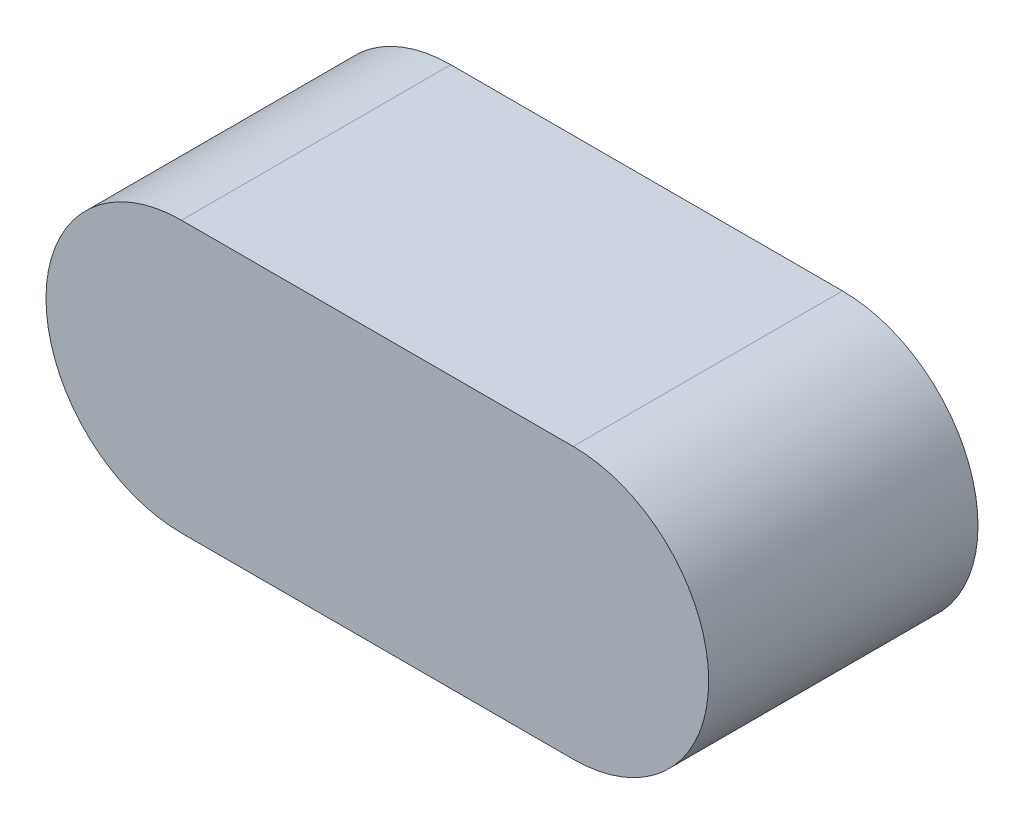
ISO-10303-21;
HEADER;
FILE_DESCRIPTION(('STEP AP214'),'2;1');
FILE_NAME('part.step','',(''),(''),'','','');
FILE_SCHEMA(('AUTOMOTIVE_DESIGN { 1 0 10303 214 1 1 1 1 }'));
ENDSEC;
DATA;
#1=APPLICATION_CONTEXT('core data for automotive mechanical design processes');
#2=APPLICATION_PROTOCOL_DEFINITION('international standard','automotive_design',2000,#1);
#3=PRODUCT_CONTEXT('',#1,'mechanical');
#4=PRODUCT('Part','Part','',(#3));
#5=PRODUCT_RELATED_PRODUCT_CATEGORY('part','',(#4));
#6=PRODUCT_DEFINITION_FORMATION('','',#4);
#7=PRODUCT_DEFINITION_CONTEXT('part definition',#1,'design');
#8=PRODUCT_DEFINITION('design','',#6,#7);
#9=PRODUCT_DEFINITION_SHAPE('','',#8);
#10=(LENGTH_UNIT() NAMED_UNIT(*) SI_UNIT(.MILLI.,.METRE.));
#11=(NAMED_UNIT(*) PLANE_ANGLE_UNIT() SI_UNIT($,.RADIAN.));
#12=(NAMED_UNIT(*) SI_UNIT($,.STERADIAN.) SOLID_ANGLE_UNIT());
#13=UNCERTAINTY_MEASURE_WITH_UNIT(LENGTH_MEASURE(1.E-05),#10,'distance_accuracy_value','');
#14=(GEOMETRIC_REPRESENTATION_CONTEXT(3) GLOBAL_UNCERTAINTY_ASSIGNED_CONTEXT((#13)) GLOBAL_UNIT_ASSIGNED_CONTEXT((#10,
#11,#12)) REPRESENTATION_CONTEXT('',''));
#15=CARTESIAN_POINT('',(0.,0.,0.));
#16=DIRECTION('',(0.,0.,1.));
#17=DIRECTION('',(1.,0.,0.));
#18=AXIS2_PLACEMENT_3D('',#15,#16,#17);
#19=CARTESIAN_POINT('',(-120.,0.,162.));
#20=DIRECTION('',(0.,0.,-1.));
#21=DIRECTION('',(-1.,0.,0.));
#22=AXIS2_PLACEMENT_3D('',#19,#20,#21);
#23=CYLINDRICAL_SURFACE('',#22,83.);
#24=CARTESIAN_POINT('',(-120.,0.,0.));
#25=DIRECTION('',(0.,0.,1.));
#26=DIRECTION('',(1.,0.,0.));
#27=AXIS2_PLACEMENT_3D('',#24,#25,#26);
#28=CIRCLE('',#27,83.);
#29=CARTESIAN_POINT('',(-120.,83.,0.));
#30=VERTEX_POINT('',#29);
#31=CARTESIAN_POINT('',(-120.,-83.,0.));
#32=VERTEX_POINT('',#31);
#33=EDGE_CURVE('E132',#30,#32,#28,.T.);
#34=ORIENTED_EDGE('',*,*,#33,.T.);
#35=DIRECTION('',(0.,0.,1.));
#36=VECTOR('',#35,1.);
#37=CARTESIAN_POINT('',(-120.,-83.,162.));
#38=LINE('',#37,#36);
#39=CARTESIAN_POINT('',(-120.,-83.,165.));
#40=VERTEX_POINT('',#39);
#41=EDGE_CURVE('E11',#40,#32,#38,.F.);
#42=ORIENTED_EDGE('',*,*,#41,.F.);
#43=CARTESIAN_POINT('',(-120.,0.,165.));
#44=DIRECTION('',(0.,0.,1.));
#45=DIRECTION('',(1.,0.,0.));
#46=AXIS2_PLACEMENT_3D('',#43,#44,#45);
#47=CIRCLE('',#46,83.);
#48=CARTESIAN_POINT('',(-120.,83.,165.));
#49=VERTEX_POINT('',#48);
#50=EDGE_CURVE('E116',#49,#40,#47,.T.);
#51=ORIENTED_EDGE('',*,*,#50,.F.);
#52=DIRECTION('',(0.,0.,-1.));
#53=VECTOR('',#52,1.);
#54=CARTESIAN_POINT('',(-120.,83.,162.));
#55=LINE('',#54,#53);
#56=EDGE_CURVE('E128',#49,#30,#55,.T.);
#57=ORIENTED_EDGE('',*,*,#56,.T.);
#58=EDGE_LOOP('',(#34,#42,#51,#57));
#59=FACE_BOUND('',#58,.T.);
#60=ADVANCED_FACE('F39',(#59),#23,.T.);
#61=CARTESIAN_POINT('',(-120.,-83.,162.));
#62=DIRECTION('',(0.,1.,0.));
#63=DIRECTION('',(0.,0.,1.));
#64=AXIS2_PLACEMENT_3D('',#61,#62,#63);
#65=PLANE('',#64);
#66=DIRECTION('',(1.,0.,0.));
#67=VECTOR('',#66,1.);
#68=CARTESIAN_POINT('',(-120.,-83.,0.));
#69=LINE('',#68,#67);
#70=CARTESIAN_POINT('',(120.,-83.,0.));
#71=VERTEX_POINT('',#70);
#72=EDGE_CURVE('E43',#32,#71,#69,.T.);
#73=ORIENTED_EDGE('',*,*,#72,.T.);
#74=DIRECTION('',(0.,0.,-1.));
#75=VECTOR('',#74,1.);
#76=CARTESIAN_POINT('',(120.,-83.,162.));
#77=LINE('',#76,#75);
#78=CARTESIAN_POINT('',(120.,-83.,165.));
#79=VERTEX_POINT('',#78);
#80=EDGE_CURVE('E48',#79,#71,#77,.T.);
#81=ORIENTED_EDGE('',*,*,#80,.F.);
#82=DIRECTION('',(1.,0.,0.));
#83=VECTOR('',#82,1.);
#84=CARTESIAN_POINT('',(-120.,-83.,165.));
#85=LINE('',#84,#83);
#86=EDGE_CURVE('E110',#40,#79,#85,.T.);
#87=ORIENTED_EDGE('',*,*,#86,.F.);
#88=ORIENTED_EDGE('',*,*,#41,.T.);
#89=EDGE_LOOP('',(#73,#81,#87,#88));
#90=FACE_BOUND('',#89,.T.);
#91=ADVANCED_FACE('F121',(#90),#65,.F.);
#92=CARTESIAN_POINT('',(120.,0.,162.));
#93=DIRECTION('',(0.,0.,-1.));
#94=DIRECTION('',(-1.,0.,0.));
#95=AXIS2_PLACEMENT_3D('',#92,#93,#94);
#96=CYLINDRICAL_SURFACE('',#95,83.);
#97=CARTESIAN_POINT('',(120.,0.,0.));
#98=DIRECTION('',(0.,0.,1.));
#99=DIRECTION('',(1.,0.,0.));
#100=AXIS2_PLACEMENT_3D('',#97,#98,#99);
#101=CIRCLE('',#100,83.);
#102=CARTESIAN_POINT('',(120.,83.,0.));
#103=VERTEX_POINT('',#102);
#104=EDGE_CURVE('E137',#71,#103,#101,.T.);
#105=ORIENTED_EDGE('',*,*,#104,.T.);
#106=DIRECTION('',(0.,0.,-1.));
#107=VECTOR('',#106,1.);
#108=CARTESIAN_POINT('',(120.,83.,162.));
#109=LINE('',#108,#107);
#110=CARTESIAN_POINT('',(120.,83.,165.));
#111=VERTEX_POINT('',#110);
#112=EDGE_CURVE('E123',#111,#103,#109,.T.);
#113=ORIENTED_EDGE('',*,*,#112,.F.);
#114=CARTESIAN_POINT('',(120.,0.,165.));
#115=DIRECTION('',(0.,0.,1.));
#116=DIRECTION('',(1.,0.,0.));
#117=AXIS2_PLACEMENT_3D('',#114,#115,#116);
#118=CIRCLE('',#117,83.);
#119=EDGE_CURVE('E113',#79,#111,#118,.T.);
#120=ORIENTED_EDGE('',*,*,#119,.F.);
#121=ORIENTED_EDGE('',*,*,#80,.T.);
#122=EDGE_LOOP('',(#105,#113,#120,#121));
#123=FACE_BOUND('',#122,.T.);
#124=ADVANCED_FACE('F125',(#123),#96,.T.);
#125=CARTESIAN_POINT('',(-120.,83.,162.));
#126=DIRECTION('',(0.,-1.,0.));
#127=DIRECTION('',(0.,0.,-1.));
#128=AXIS2_PLACEMENT_3D('',#125,#126,#127);
#129=PLANE('',#128);
#130=DIRECTION('',(-1.,0.,0.));
#131=VECTOR('',#130,1.);
#132=CARTESIAN_POINT('',(-120.,83.,0.));
#133=LINE('',#132,#131);
#134=EDGE_CURVE('E136',#103,#30,#133,.T.);
#135=ORIENTED_EDGE('',*,*,#134,.T.);
#136=ORIENTED_EDGE('',*,*,#56,.F.);
#137=DIRECTION('',(-1.,0.,0.));
#138=VECTOR('',#137,1.);
#139=CARTESIAN_POINT('',(-120.,83.,165.));
#140=LINE('',#139,#138);
#141=EDGE_CURVE('E65',#111,#49,#140,.T.);
#142=ORIENTED_EDGE('',*,*,#141,.F.);
#143=ORIENTED_EDGE('',*,*,#112,.T.);
#144=EDGE_LOOP('',(#135,#136,#142,#143));
#145=FACE_BOUND('',#144,.T.);
#146=ADVANCED_FACE('F140',(#145),#129,.F.);
#147=CARTESIAN_POINT('',(-120.,0.,165.));
#148=DIRECTION('',(0.,0.,1.));
#149=DIRECTION('',(1.,0.,0.));
#150=AXIS2_PLACEMENT_3D('',#147,#148,#149);
#151=PLANE('',#150);
#152=ORIENTED_EDGE('',*,*,#50,.T.);
#153=ORIENTED_EDGE('',*,*,#86,.T.);
#154=ORIENTED_EDGE('',*,*,#119,.T.);
#155=ORIENTED_EDGE('',*,*,#141,.T.);
#156=EDGE_LOOP('',(#152,#153,#154,#155));
#157=FACE_BOUND('',#156,.T.);
#158=ADVANCED_FACE('F41',(#157),#151,.T.);
#159=CARTESIAN_POINT('',(-120.,0.,0.));
#160=DIRECTION('',(0.,0.,1.));
#161=DIRECTION('',(1.,0.,0.));
#162=AXIS2_PLACEMENT_3D('',#159,#160,#161);
#163=PLANE('',#162);
#164=DIRECTION('',(-1.,0.,0.));
#165=VECTOR('',#164,1.);
#166=CARTESIAN_POINT('',(-120.,80.,0.));
#167=LINE('',#166,#165);
#168=CARTESIAN_POINT('',(120.,80.,0.));
#169=VERTEX_POINT('',#168);
#170=CARTESIAN_POINT('',(-120.,80.,0.));
#171=VERTEX_POINT('',#170);
#172=EDGE_CURVE('E155',#169,#171,#167,.T.);
#173=ORIENTED_EDGE('',*,*,#172,.T.);
#174=CARTESIAN_POINT('',(-120.,0.,0.));
#175=DIRECTION('',(0.,0.,1.));
#176=DIRECTION('',(1.,0.,0.));
#177=AXIS2_PLACEMENT_3D('',#174,#175,#176);
#178=CIRCLE('',#177,80.);
#179=CARTESIAN_POINT('',(-120.,-80.,0.));
#180=VERTEX_POINT('',#179);
#181=EDGE_CURVE('E163',#171,#180,#178,.T.);
#182=ORIENTED_EDGE('',*,*,#181,.T.);
#183=DIRECTION('',(1.,0.,0.));
#184=VECTOR('',#183,1.);
#185=CARTESIAN_POINT('',(-120.,-80.,0.));
#186=LINE('',#185,#184);
#187=CARTESIAN_POINT('',(120.,-80.,0.));
#188=VERTEX_POINT('',#187);
#189=EDGE_CURVE('E160',#180,#188,#186,.T.);
#190=ORIENTED_EDGE('',*,*,#189,.T.);
#191=CARTESIAN_POINT('',(120.,0.,0.));
#192=DIRECTION('',(0.,0.,1.));
#193=DIRECTION('',(1.,0.,0.));
#194=AXIS2_PLACEMENT_3D('',#191,#192,#193);
#195=CIRCLE('',#194,80.);
#196=EDGE_CURVE('E56',#188,#169,#195,.T.);
#197=ORIENTED_EDGE('',*,*,#196,.T.);
#198=EDGE_LOOP('',(#173,#182,#190,#197));
#199=FACE_BOUND('',#198,.T.);
#200=ORIENTED_EDGE('',*,*,#33,.F.);
#201=ORIENTED_EDGE('',*,*,#134,.F.);
#202=ORIENTED_EDGE('',*,*,#104,.F.);
#203=ORIENTED_EDGE('',*,*,#72,.F.);
#204=EDGE_LOOP('',(#200,#201,#202,#203));
#205=FACE_BOUND('',#204,.T.);
#206=ADVANCED_FACE('F142',(#199,#205),#163,.F.);
#207=CARTESIAN_POINT('',(-120.,0.,162.));
#208=DIRECTION('',(0.,0.,-1.));
#209=DIRECTION('',(-1.,0.,0.));
#210=AXIS2_PLACEMENT_3D('',#207,#208,#209);
#211=CYLINDRICAL_SURFACE('',#210,80.);
#212=ORIENTED_EDGE('',*,*,#181,.F.);
#213=DIRECTION('',(0.,0.,-1.));
#214=VECTOR('',#213,1.);
#215=CARTESIAN_POINT('',(-120.,80.,162.));
#216=LINE('',#215,#214);
#217=CARTESIAN_POINT('',(-120.,80.,162.));
#218=VERTEX_POINT('',#217);
#219=EDGE_CURVE('E153',#218,#171,#216,.T.);
#220=ORIENTED_EDGE('',*,*,#219,.F.);
#221=CARTESIAN_POINT('',(-120.,0.,162.));
#222=DIRECTION('',(0.,0.,1.));
#223=DIRECTION('',(1.,0.,0.));
#224=AXIS2_PLACEMENT_3D('',#221,#222,#223);
#225=CIRCLE('',#224,80.);
#226=CARTESIAN_POINT('',(-120.,-80.,162.));
#227=VERTEX_POINT('',#226);
#228=EDGE_CURVE('E158',#218,#227,#225,.T.);
#229=ORIENTED_EDGE('',*,*,#228,.T.);
#230=DIRECTION('',(0.,0.,-1.));
#231=VECTOR('',#230,1.);
#232=CARTESIAN_POINT('',(-120.,-80.,162.));
#233=LINE('',#232,#231);
#234=EDGE_CURVE('E135',#227,#180,#233,.T.);
#235=ORIENTED_EDGE('',*,*,#234,.T.);
#236=EDGE_LOOP('',(#212,#220,#229,#235));
#237=FACE_BOUND('',#236,.T.);
#238=ADVANCED_FACE('F177',(#237),#211,.F.);
#239=CARTESIAN_POINT('',(-120.,-80.,162.));
#240=DIRECTION('',(0.,1.,0.));
#241=DIRECTION('',(0.,0.,1.));
#242=AXIS2_PLACEMENT_3D('',#239,#240,#241);
#243=PLANE('',#242);
#244=ORIENTED_EDGE('',*,*,#189,.F.);
#245=ORIENTED_EDGE('',*,*,#234,.F.);
#246=DIRECTION('',(1.,0.,0.));
#247=VECTOR('',#246,1.);
#248=CARTESIAN_POINT('',(-120.,-80.,162.));
#249=LINE('',#248,#247);
#250=CARTESIAN_POINT('',(120.,-80.,162.));
#251=VERTEX_POINT('',#250);
#252=EDGE_CURVE('E169',#227,#251,#249,.T.);
#253=ORIENTED_EDGE('',*,*,#252,.T.);
#254=DIRECTION('',(0.,0.,-1.));
#255=VECTOR('',#254,1.);
#256=CARTESIAN_POINT('',(120.,-80.,162.));
#257=LINE('',#256,#255);
#258=EDGE_CURVE('E149',#251,#188,#257,.T.);
#259=ORIENTED_EDGE('',*,*,#258,.T.);
#260=EDGE_LOOP('',(#244,#245,#253,#259));
#261=FACE_BOUND('',#260,.T.);
#262=ADVANCED_FACE('F182',(#261),#243,.T.);
#263=CARTESIAN_POINT('',(120.,0.,162.));
#264=DIRECTION('',(0.,0.,-1.));
#265=DIRECTION('',(-1.,0.,0.));
#266=AXIS2_PLACEMENT_3D('',#263,#264,#265);
#267=CYLINDRICAL_SURFACE('',#266,80.);
#268=ORIENTED_EDGE('',*,*,#196,.F.);
#269=ORIENTED_EDGE('',*,*,#258,.F.);
#270=CARTESIAN_POINT('',(120.,0.,162.));
#271=DIRECTION('',(0.,0.,1.));
#272=DIRECTION('',(1.,0.,0.));
#273=AXIS2_PLACEMENT_3D('',#270,#271,#272);
#274=CIRCLE('',#273,80.);
#275=CARTESIAN_POINT('',(120.,80.,162.));
#276=VERTEX_POINT('',#275);
#277=EDGE_CURVE('E167',#251,#276,#274,.T.);
#278=ORIENTED_EDGE('',*,*,#277,.T.);
#279=DIRECTION('',(0.,0.,-1.));
#280=VECTOR('',#279,1.);
#281=CARTESIAN_POINT('',(120.,80.,162.));
#282=LINE('',#281,#280);
#283=EDGE_CURVE('E151',#276,#169,#282,.T.);
#284=ORIENTED_EDGE('',*,*,#283,.T.);
#285=EDGE_LOOP('',(#268,#269,#278,#284));
#286=FACE_BOUND('',#285,.T.);
#287=ADVANCED_FACE('F188',(#286),#267,.F.);
#288=CARTESIAN_POINT('',(-120.,80.,162.));
#289=DIRECTION('',(0.,-1.,0.));
#290=DIRECTION('',(0.,0.,-1.));
#291=AXIS2_PLACEMENT_3D('',#288,#289,#290);
#292=PLANE('',#291);
#293=ORIENTED_EDGE('',*,*,#172,.F.);
#294=ORIENTED_EDGE('',*,*,#283,.F.);
#295=DIRECTION('',(-1.,0.,0.));
#296=VECTOR('',#295,1.);
#297=CARTESIAN_POINT('',(-120.,80.,162.));
#298=LINE('',#297,#296);
#299=EDGE_CURVE('E93',#276,#218,#298,.T.);
#300=ORIENTED_EDGE('',*,*,#299,.T.);
#301=ORIENTED_EDGE('',*,*,#219,.T.);
#302=EDGE_LOOP('',(#293,#294,#300,#301));
#303=FACE_BOUND('',#302,.T.);
#304=ADVANCED_FACE('F185',(#303),#292,.T.);
#305=CARTESIAN_POINT('',(-120.,0.,162.));
#306=DIRECTION('',(0.,0.,1.));
#307=DIRECTION('',(1.,0.,0.));
#308=AXIS2_PLACEMENT_3D('',#305,#306,#307);
#309=PLANE('',#308);
#310=ORIENTED_EDGE('',*,*,#228,.F.);
#311=ORIENTED_EDGE('',*,*,#299,.F.);
#312=ORIENTED_EDGE('',*,*,#277,.F.);
#313=ORIENTED_EDGE('',*,*,#252,.F.);
#314=EDGE_LOOP('',(#310,#311,#312,#313));
#315=FACE_BOUND('',#314,.T.);
#316=ADVANCED_FACE('F187',(#315),#309,.F.);
#317=CLOSED_SHELL('',(#60,#91,#124,#146,#158,#206,#238,#262,#287,#304,#316));
#318=MANIFOLD_SOLID_BREP('B2',#317);
#319=ADVANCED_BREP_SHAPE_REPRESENTATION('',(#18,#318),#14);
#320=SHAPE_DEFINITION_REPRESENTATION(#9,#319);
ENDSEC;
END-ISO-10303-21;
